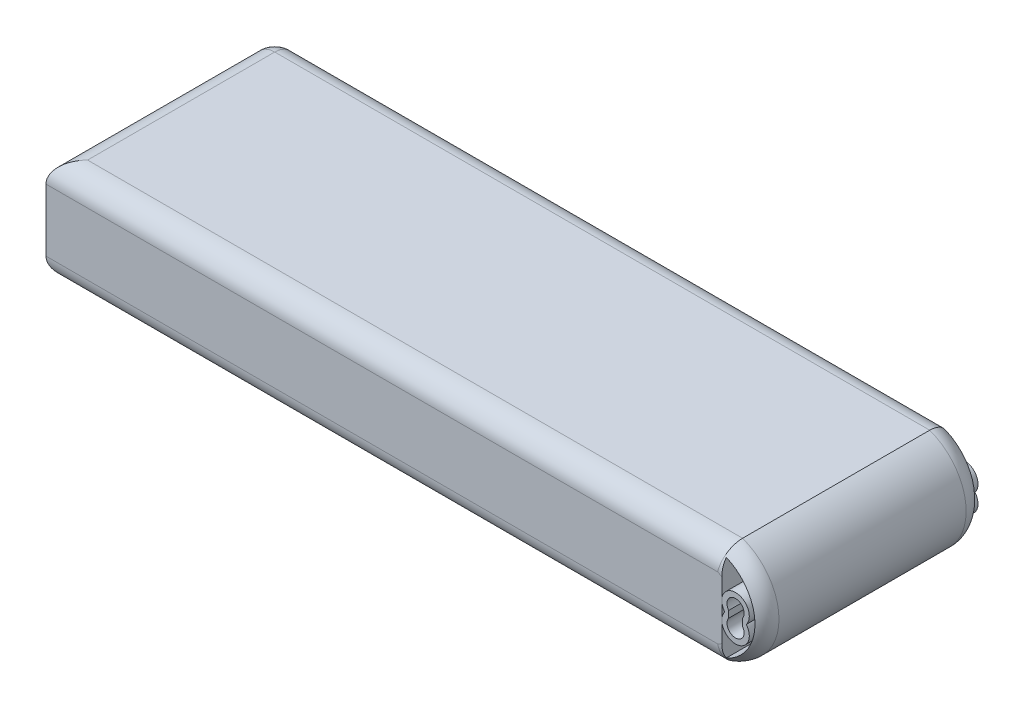
ISO-10303-21;
HEADER;
FILE_DESCRIPTION(('STEP AP214'),'2;1');
FILE_NAME('part.step','',(''),(''),'','','');
FILE_SCHEMA(('AUTOMOTIVE_DESIGN { 1 0 10303 214 1 1 1 1 }'));
ENDSEC;
DATA;
#1=APPLICATION_CONTEXT('core data for automotive mechanical design processes');
#2=APPLICATION_PROTOCOL_DEFINITION('international standard','automotive_design',2000,#1);
#3=PRODUCT_CONTEXT('',#1,'mechanical');
#4=PRODUCT('Part','Part','',(#3));
#5=PRODUCT_RELATED_PRODUCT_CATEGORY('part','',(#4));
#6=PRODUCT_DEFINITION_FORMATION('','',#4);
#7=PRODUCT_DEFINITION_CONTEXT('part definition',#1,'design');
#8=PRODUCT_DEFINITION('design','',#6,#7);
#9=PRODUCT_DEFINITION_SHAPE('','',#8);
#10=(LENGTH_UNIT() NAMED_UNIT(*) SI_UNIT(.MILLI.,.METRE.));
#11=(NAMED_UNIT(*) PLANE_ANGLE_UNIT() SI_UNIT($,.RADIAN.));
#12=(NAMED_UNIT(*) SI_UNIT($,.STERADIAN.) SOLID_ANGLE_UNIT());
#13=UNCERTAINTY_MEASURE_WITH_UNIT(LENGTH_MEASURE(1.E-05),#10,'distance_accuracy_value','');
#14=(GEOMETRIC_REPRESENTATION_CONTEXT(3) GLOBAL_UNCERTAINTY_ASSIGNED_CONTEXT((#13)) GLOBAL_UNIT_ASSIGNED_CONTEXT((#10,
#11,#12)) REPRESENTATION_CONTEXT('',''));
#15=CARTESIAN_POINT('',(0.,0.,0.));
#16=DIRECTION('',(0.,0.,1.));
#17=DIRECTION('',(1.,0.,0.));
#18=AXIS2_PLACEMENT_3D('',#15,#16,#17);
#19=CARTESIAN_POINT('',(132.644271500693,11.6442715006931,-10.076462245077));
#20=DIRECTION('',(0.,0.,1.));
#21=DIRECTION('',(1.,0.,0.));
#22=AXIS2_PLACEMENT_3D('',#19,#20,#21);
#23=CYLINDRICAL_SURFACE('',#22,1.64427150069308);
#24=DIRECTION('',(0.,0.,1.));
#25=VECTOR('',#24,1.);
#26=CARTESIAN_POINT('',(131.333122613471,10.6520430171627,-10.076462245077));
#27=LINE('',#26,#25);
#28=CARTESIAN_POINT('',(131.333122613471,10.6520430171627,0.));
#29=VERTEX_POINT('',#28);
#30=CARTESIAN_POINT('',(131.333122613471,10.6520430171627,44.));
#31=VERTEX_POINT('',#30);
#32=EDGE_CURVE('E127',#29,#31,#27,.T.);
#33=ORIENTED_EDGE('',*,*,#32,.F.);
#34=CARTESIAN_POINT('',(132.644271500693,11.6442715006931,0.));
#35=DIRECTION('',(0.,0.,1.));
#36=DIRECTION('',(1.,0.,0.));
#37=AXIS2_PLACEMENT_3D('',#34,#35,#36);
#38=CIRCLE('',#37,1.64427150069308);
#39=CARTESIAN_POINT('',(133.955420387915,10.6520430171627,0.));
#40=VERTEX_POINT('',#39);
#41=EDGE_CURVE('E131',#29,#40,#38,.F.);
#42=ORIENTED_EDGE('',*,*,#41,.T.);
#43=DIRECTION('',(0.,0.,1.));
#44=VECTOR('',#43,1.);
#45=CARTESIAN_POINT('',(133.955420387915,10.6520430171627,-10.076462245077));
#46=LINE('',#45,#44);
#47=CARTESIAN_POINT('',(133.955420387915,10.6520430171627,44.));
#48=VERTEX_POINT('',#47);
#49=EDGE_CURVE('E134',#40,#48,#46,.T.);
#50=ORIENTED_EDGE('',*,*,#49,.T.);
#51=CARTESIAN_POINT('',(132.644271500693,11.6442715006931,44.));
#52=DIRECTION('',(0.,0.,1.));
#53=DIRECTION('',(1.,0.,0.));
#54=AXIS2_PLACEMENT_3D('',#51,#52,#53);
#55=CIRCLE('',#54,1.64427150069308);
#56=EDGE_CURVE('E125',#48,#31,#55,.T.);
#57=ORIENTED_EDGE('',*,*,#56,.T.);
#58=EDGE_LOOP('',(#33,#42,#50,#57));
#59=FACE_BOUND('',#58,.T.);
#60=ADVANCED_FACE('F55',(#59),#23,.F.);
#61=CARTESIAN_POINT('',(131.333122613471,0.,-10.076462245077));
#62=DIRECTION('',(-1.,0.,0.));
#63=DIRECTION('',(0.,0.,1.));
#64=AXIS2_PLACEMENT_3D('',#61,#62,#63);
#65=PLANE('',#64);
#66=DIRECTION('',(0.,0.,1.));
#67=VECTOR('',#66,1.);
#68=CARTESIAN_POINT('',(131.333122613471,9.34795698283731,-10.076462245077));
#69=LINE('',#68,#67);
#70=CARTESIAN_POINT('',(131.333122613471,9.34795698283731,0.));
#71=VERTEX_POINT('',#70);
#72=CARTESIAN_POINT('',(131.333122613471,9.34795698283731,44.));
#73=VERTEX_POINT('',#72);
#74=EDGE_CURVE('E128',#71,#73,#69,.T.);
#75=ORIENTED_EDGE('',*,*,#74,.F.);
#76=DIRECTION('',(0.,1.,0.));
#77=VECTOR('',#76,1.);
#78=CARTESIAN_POINT('',(131.333122613471,0.,0.));
#79=LINE('',#78,#77);
#80=EDGE_CURVE('E129',#71,#29,#79,.T.);
#81=ORIENTED_EDGE('',*,*,#80,.T.);
#82=ORIENTED_EDGE('',*,*,#32,.T.);
#83=DIRECTION('',(0.,-1.,0.));
#84=VECTOR('',#83,1.);
#85=CARTESIAN_POINT('',(131.333122613471,0.,44.));
#86=LINE('',#85,#84);
#87=EDGE_CURVE('E126',#31,#73,#86,.T.);
#88=ORIENTED_EDGE('',*,*,#87,.T.);
#89=EDGE_LOOP('',(#75,#81,#82,#88));
#90=FACE_BOUND('',#89,.T.);
#91=ADVANCED_FACE('F161',(#90),#65,.F.);
#92=CARTESIAN_POINT('',(132.644271500693,8.35572849930693,-10.076462245077));
#93=DIRECTION('',(0.,0.,1.));
#94=DIRECTION('',(1.,0.,0.));
#95=AXIS2_PLACEMENT_3D('',#92,#93,#94);
#96=CYLINDRICAL_SURFACE('',#95,1.64427150069308);
#97=CARTESIAN_POINT('',(132.644271500693,8.35572849930693,0.));
#98=DIRECTION('',(0.,0.,1.));
#99=DIRECTION('',(1.,0.,0.));
#100=AXIS2_PLACEMENT_3D('',#97,#98,#99);
#101=CIRCLE('',#100,1.64427150069308);
#102=CARTESIAN_POINT('',(133.955420387915,9.34795698283731,0.));
#103=VERTEX_POINT('',#102);
#104=EDGE_CURVE('E57',#71,#103,#101,.T.);
#105=ORIENTED_EDGE('',*,*,#104,.F.);
#106=ORIENTED_EDGE('',*,*,#74,.T.);
#107=CARTESIAN_POINT('',(132.644271500693,8.35572849930693,44.));
#108=DIRECTION('',(0.,0.,1.));
#109=DIRECTION('',(1.,0.,0.));
#110=AXIS2_PLACEMENT_3D('',#107,#108,#109);
#111=CIRCLE('',#110,1.64427150069308);
#112=CARTESIAN_POINT('',(133.955420387915,9.34795698283731,44.));
#113=VERTEX_POINT('',#112);
#114=EDGE_CURVE('E116',#113,#73,#111,.F.);
#115=ORIENTED_EDGE('',*,*,#114,.F.);
#116=DIRECTION('',(0.,0.,1.));
#117=VECTOR('',#116,1.);
#118=CARTESIAN_POINT('',(133.955420387915,9.34795698283731,-10.076462245077));
#119=LINE('',#118,#117);
#120=EDGE_CURVE('E113',#103,#113,#119,.T.);
#121=ORIENTED_EDGE('',*,*,#120,.F.);
#122=EDGE_LOOP('',(#105,#106,#115,#121));
#123=FACE_BOUND('',#122,.T.);
#124=ADVANCED_FACE('F158',(#123),#96,.F.);
#125=CARTESIAN_POINT('',(132.644271500693,8.35572849930693,-10.076462245077));
#126=DIRECTION('',(0.,0.,1.));
#127=DIRECTION('',(1.,0.,0.));
#128=AXIS2_PLACEMENT_3D('',#125,#126,#127);
#129=CYLINDRICAL_SURFACE('',#128,2.64427150069308);
#130=DIRECTION('',(0.,0.,1.));
#131=VECTOR('',#130,1.);
#132=CARTESIAN_POINT('',(130.573391735621,10.,-10.076462245077));
#133=LINE('',#132,#131);
#134=CARTESIAN_POINT('',(130.573391735621,10.,0.));
#135=VERTEX_POINT('',#134);
#136=CARTESIAN_POINT('',(130.573391735621,10.,44.));
#137=VERTEX_POINT('',#136);
#138=EDGE_CURVE('E100',#135,#137,#133,.T.);
#139=ORIENTED_EDGE('',*,*,#138,.F.);
#140=CARTESIAN_POINT('',(132.644271500693,8.35572849930693,0.));
#141=DIRECTION('',(0.,0.,1.));
#142=DIRECTION('',(1.,0.,0.));
#143=AXIS2_PLACEMENT_3D('',#140,#141,#142);
#144=CIRCLE('',#143,2.64427150069308);
#145=CARTESIAN_POINT('',(134.715151265765,10.,0.));
#146=VERTEX_POINT('',#145);
#147=EDGE_CURVE('E67',#135,#146,#144,.T.);
#148=ORIENTED_EDGE('',*,*,#147,.T.);
#149=DIRECTION('',(0.,0.,1.));
#150=VECTOR('',#149,1.);
#151=CARTESIAN_POINT('',(134.715151265765,10.,-10.076462245077));
#152=LINE('',#151,#150);
#153=CARTESIAN_POINT('',(134.715151265765,10.,44.));
#154=VERTEX_POINT('',#153);
#155=EDGE_CURVE('E105',#146,#154,#152,.T.);
#156=ORIENTED_EDGE('',*,*,#155,.T.);
#157=CARTESIAN_POINT('',(132.644271500693,8.35572849930693,44.));
#158=DIRECTION('',(0.,0.,1.));
#159=DIRECTION('',(1.,0.,0.));
#160=AXIS2_PLACEMENT_3D('',#157,#158,#159);
#161=CIRCLE('',#160,2.64427150069308);
#162=EDGE_CURVE('E104',#154,#137,#161,.F.);
#163=ORIENTED_EDGE('',*,*,#162,.T.);
#164=EDGE_LOOP('',(#139,#148,#156,#163));
#165=FACE_BOUND('',#164,.T.);
#166=ADVANCED_FACE('F102',(#165),#129,.T.);
#167=CARTESIAN_POINT('',(132.644271500693,11.6442715006931,-10.076462245077));
#168=DIRECTION('',(0.,0.,1.));
#169=DIRECTION('',(1.,0.,0.));
#170=AXIS2_PLACEMENT_3D('',#167,#168,#169);
#171=CYLINDRICAL_SURFACE('',#170,2.64427150069308);
#172=CARTESIAN_POINT('',(132.644271500693,11.6442715006931,0.));
#173=DIRECTION('',(0.,0.,1.));
#174=DIRECTION('',(1.,0.,0.));
#175=AXIS2_PLACEMENT_3D('',#172,#173,#174);
#176=CIRCLE('',#175,2.64427150069308);
#177=EDGE_CURVE('E12',#135,#146,#176,.F.);
#178=ORIENTED_EDGE('',*,*,#177,.F.);
#179=ORIENTED_EDGE('',*,*,#138,.T.);
#180=CARTESIAN_POINT('',(132.644271500693,11.6442715006931,44.));
#181=DIRECTION('',(0.,0.,1.));
#182=DIRECTION('',(1.,0.,0.));
#183=AXIS2_PLACEMENT_3D('',#180,#181,#182);
#184=CIRCLE('',#183,2.64427150069308);
#185=EDGE_CURVE('E112',#154,#137,#184,.T.);
#186=ORIENTED_EDGE('',*,*,#185,.F.);
#187=ORIENTED_EDGE('',*,*,#155,.F.);
#188=EDGE_LOOP('',(#178,#179,#186,#187));
#189=FACE_BOUND('',#188,.T.);
#190=ADVANCED_FACE('F114',(#189),#171,.T.);
#191=CARTESIAN_POINT('',(133.955420387915,0.,-10.076462245077));
#192=DIRECTION('',(-1.,0.,0.));
#193=DIRECTION('',(0.,0.,1.));
#194=AXIS2_PLACEMENT_3D('',#191,#192,#193);
#195=PLANE('',#194);
#196=DIRECTION('',(0.,1.,0.));
#197=VECTOR('',#196,1.);
#198=CARTESIAN_POINT('',(133.955420387915,0.,0.));
#199=LINE('',#198,#197);
#200=EDGE_CURVE('E65',#103,#40,#199,.T.);
#201=ORIENTED_EDGE('',*,*,#200,.F.);
#202=ORIENTED_EDGE('',*,*,#120,.T.);
#203=DIRECTION('',(0.,-1.,0.));
#204=VECTOR('',#203,1.);
#205=CARTESIAN_POINT('',(133.955420387915,0.,44.));
#206=LINE('',#205,#204);
#207=EDGE_CURVE('E111',#48,#113,#206,.T.);
#208=ORIENTED_EDGE('',*,*,#207,.F.);
#209=ORIENTED_EDGE('',*,*,#49,.F.);
#210=EDGE_LOOP('',(#201,#202,#208,#209));
#211=FACE_BOUND('',#210,.T.);
#212=ADVANCED_FACE('F153',(#211),#195,.T.);
#213=CARTESIAN_POINT('',(0.,0.,44.));
#214=DIRECTION('',(0.,0.,1.));
#215=DIRECTION('',(1.,0.,0.));
#216=AXIS2_PLACEMENT_3D('',#213,#214,#215);
#217=PLANE('',#216);
#218=ORIENTED_EDGE('',*,*,#162,.F.);
#219=ORIENTED_EDGE('',*,*,#185,.T.);
#220=EDGE_LOOP('',(#218,#219));
#221=FACE_BOUND('',#220,.T.);
#222=ORIENTED_EDGE('',*,*,#56,.F.);
#223=ORIENTED_EDGE('',*,*,#207,.T.);
#224=ORIENTED_EDGE('',*,*,#114,.T.);
#225=ORIENTED_EDGE('',*,*,#87,.F.);
#226=EDGE_LOOP('',(#222,#223,#224,#225));
#227=FACE_BOUND('',#226,.T.);
#228=ADVANCED_FACE('F108',(#221,#227),#217,.T.);
#229=CARTESIAN_POINT('',(0.,0.,0.));
#230=DIRECTION('',(0.,0.,1.));
#231=DIRECTION('',(1.,0.,0.));
#232=AXIS2_PLACEMENT_3D('',#229,#230,#231);
#233=PLANE('',#232);
#234=ORIENTED_EDGE('',*,*,#80,.F.);
#235=ORIENTED_EDGE('',*,*,#104,.T.);
#236=ORIENTED_EDGE('',*,*,#200,.T.);
#237=ORIENTED_EDGE('',*,*,#41,.F.);
#238=EDGE_LOOP('',(#234,#235,#236,#237));
#239=FACE_BOUND('',#238,.T.);
#240=ORIENTED_EDGE('',*,*,#177,.T.);
#241=ORIENTED_EDGE('',*,*,#147,.F.);
#242=EDGE_LOOP('',(#240,#241));
#243=FACE_BOUND('',#242,.T.);
#244=ADVANCED_FACE('F53',(#239,#243),#233,.F.);
#245=CLOSED_SHELL('',(#60,#91,#124,#166,#190,#212,#228,#244));
#246=MANIFOLD_SOLID_BREP('B2',#245);
#247=CARTESIAN_POINT('',(0.,20.,44.));
#248=DIRECTION('',(0.,1.,0.));
#249=DIRECTION('',(0.,0.,1.));
#250=AXIS2_PLACEMENT_3D('',#247,#248,#249);
#251=PLANE('',#250);
#252=DIRECTION('',(0.,0.,-1.));
#253=VECTOR('',#252,1.);
#254=CARTESIAN_POINT('',(130.,20.,44.));
#255=LINE('',#254,#253);
#256=CARTESIAN_POINT('',(130.,20.,40.));
#257=VERTEX_POINT('',#256);
#258=CARTESIAN_POINT('',(130.,20.,4.));
#259=VERTEX_POINT('',#258);
#260=EDGE_CURVE('E467',#257,#259,#255,.T.);
#261=ORIENTED_EDGE('',*,*,#260,.T.);
#262=DIRECTION('',(1.,0.,0.));
#263=VECTOR('',#262,1.);
#264=CARTESIAN_POINT('',(0.,20.,4.));
#265=LINE('',#264,#263);
#266=CARTESIAN_POINT('',(4.,20.,4.));
#267=VERTEX_POINT('',#266);
#268=EDGE_CURVE('E544',#259,#267,#265,.F.);
#269=ORIENTED_EDGE('',*,*,#268,.T.);
#270=DIRECTION('',(0.,0.,-1.));
#271=VECTOR('',#270,1.);
#272=CARTESIAN_POINT('',(4.,20.,44.));
#273=LINE('',#272,#271);
#274=CARTESIAN_POINT('',(4.,20.,40.));
#275=VERTEX_POINT('',#274);
#276=EDGE_CURVE('E538',#267,#275,#273,.F.);
#277=ORIENTED_EDGE('',*,*,#276,.T.);
#278=DIRECTION('',(1.,0.,0.));
#279=VECTOR('',#278,1.);
#280=CARTESIAN_POINT('',(0.,20.,40.));
#281=LINE('',#280,#279);
#282=EDGE_CURVE('E539',#275,#257,#281,.T.);
#283=ORIENTED_EDGE('',*,*,#282,.T.);
#284=EDGE_LOOP('',(#261,#269,#277,#283));
#285=FACE_BOUND('',#284,.T.);
#286=ADVANCED_FACE('F241',(#285),#251,.T.);
#287=CARTESIAN_POINT('',(0.,0.,44.));
#288=DIRECTION('',(-1.,0.,0.));
#289=DIRECTION('',(0.,0.,1.));
#290=AXIS2_PLACEMENT_3D('',#287,#288,#289);
#291=PLANE('',#290);
#292=DIRECTION('',(0.,1.,0.));
#293=VECTOR('',#292,1.);
#294=CARTESIAN_POINT('',(0.,0.,4.));
#295=LINE('',#294,#293);
#296=CARTESIAN_POINT('',(0.,16.,4.));
#297=VERTEX_POINT('',#296);
#298=CARTESIAN_POINT('',(0.,4.,4.));
#299=VERTEX_POINT('',#298);
#300=EDGE_CURVE('E483',#297,#299,#295,.F.);
#301=ORIENTED_EDGE('',*,*,#300,.T.);
#302=DIRECTION('',(0.,0.,-1.));
#303=VECTOR('',#302,1.);
#304=CARTESIAN_POINT('',(0.,4.,44.));
#305=LINE('',#304,#303);
#306=CARTESIAN_POINT('',(0.,4.,44.));
#307=VERTEX_POINT('',#306);
#308=EDGE_CURVE('E486',#299,#307,#305,.F.);
#309=ORIENTED_EDGE('',*,*,#308,.T.);
#310=DIRECTION('',(0.,1.,0.));
#311=VECTOR('',#310,1.);
#312=CARTESIAN_POINT('',(0.,0.,44.));
#313=LINE('',#312,#311);
#314=CARTESIAN_POINT('',(0.,16.,44.));
#315=VERTEX_POINT('',#314);
#316=EDGE_CURVE('E473',#307,#315,#313,.T.);
#317=ORIENTED_EDGE('',*,*,#316,.T.);
#318=DIRECTION('',(0.,0.,-1.));
#319=VECTOR('',#318,1.);
#320=CARTESIAN_POINT('',(0.,16.,44.));
#321=LINE('',#320,#319);
#322=EDGE_CURVE('E481',#315,#297,#321,.T.);
#323=ORIENTED_EDGE('',*,*,#322,.T.);
#324=EDGE_LOOP('',(#301,#309,#317,#323));
#325=FACE_BOUND('',#324,.T.);
#326=ADVANCED_FACE('F439',(#325),#291,.T.);
#327=CARTESIAN_POINT('',(0.,0.,44.));
#328=DIRECTION('',(0.,1.,0.));
#329=DIRECTION('',(0.,0.,1.));
#330=AXIS2_PLACEMENT_3D('',#327,#328,#329);
#331=PLANE('',#330);
#332=DIRECTION('',(0.,0.,-1.));
#333=VECTOR('',#332,1.);
#334=CARTESIAN_POINT('',(4.,0.,0.));
#335=LINE('',#334,#333);
#336=CARTESIAN_POINT('',(4.,0.,40.));
#337=VERTEX_POINT('',#336);
#338=CARTESIAN_POINT('',(4.,0.,4.));
#339=VERTEX_POINT('',#338);
#340=EDGE_CURVE('E488',#337,#339,#335,.T.);
#341=ORIENTED_EDGE('',*,*,#340,.T.);
#342=DIRECTION('',(1.,0.,0.));
#343=VECTOR('',#342,1.);
#344=CARTESIAN_POINT('',(0.,0.,4.));
#345=LINE('',#344,#343);
#346=CARTESIAN_POINT('',(130.,0.,4.));
#347=VERTEX_POINT('',#346);
#348=EDGE_CURVE('E495',#339,#347,#345,.T.);
#349=ORIENTED_EDGE('',*,*,#348,.T.);
#350=DIRECTION('',(0.,0.,-1.));
#351=VECTOR('',#350,1.);
#352=CARTESIAN_POINT('',(130.,0.,44.));
#353=LINE('',#352,#351);
#354=CARTESIAN_POINT('',(130.,0.,40.));
#355=VERTEX_POINT('',#354);
#356=EDGE_CURVE('E469',#355,#347,#353,.T.);
#357=ORIENTED_EDGE('',*,*,#356,.F.);
#358=DIRECTION('',(1.,0.,0.));
#359=VECTOR('',#358,1.);
#360=CARTESIAN_POINT('',(0.,0.,40.));
#361=LINE('',#360,#359);
#362=EDGE_CURVE('E489',#355,#337,#361,.F.);
#363=ORIENTED_EDGE('',*,*,#362,.T.);
#364=EDGE_LOOP('',(#341,#349,#357,#363));
#365=FACE_BOUND('',#364,.T.);
#366=ADVANCED_FACE('F448',(#365),#331,.F.);
#367=CARTESIAN_POINT('',(130.,0.,44.));
#368=DIRECTION('',(1.,0.,0.));
#369=DIRECTION('',(0.,0.,-1.));
#370=AXIS2_PLACEMENT_3D('',#367,#368,#369);
#371=PLANE('',#370);
#372=DIRECTION('',(0.,-1.,0.));
#373=VECTOR('',#372,1.);
#374=CARTESIAN_POINT('',(130.,0.,0.));
#375=LINE('',#374,#373);
#376=CARTESIAN_POINT('',(130.,15.5549205986353,0.));
#377=VERTEX_POINT('',#376);
#378=CARTESIAN_POINT('',(130.,4.44507940136469,0.));
#379=VERTEX_POINT('',#378);
#380=EDGE_CURVE('E349',#377,#379,#375,.T.);
#381=ORIENTED_EDGE('',*,*,#380,.F.);
#382=CARTESIAN_POINT('',(130.,15.5549205986353,0.));
#383=CARTESIAN_POINT('',(130.,15.6976238443516,-2.41215455075251E-05));
#384=CARTESIAN_POINT('',(130.,15.8403814407999,0.00534121100765735));
#385=CARTESIAN_POINT('',(130.,16.1251599813797,0.0274343705767493));
#386=CARTESIAN_POINT('',(130.,16.2671799722999,0.0441743661980458));
#387=CARTESIAN_POINT('',(130.,16.5453785254367,0.0889670740029389));
#388=CARTESIAN_POINT('',(130.,16.6816093150312,0.116689970074863));
#389=CARTESIAN_POINT('',(130.,16.951090077618,0.183722170748763));
#390=CARTESIAN_POINT('',(130.,17.084341520462,0.22302562007874));
#391=CARTESIAN_POINT('',(130.,17.4219262991574,0.339352781068202));
#392=CARTESIAN_POINT('',(130.,17.623383710497,0.425098612690218));
#393=CARTESIAN_POINT('',(130.,17.916334253673,0.576500390907117));
#394=CARTESIAN_POINT('',(130.,18.0134699144604,0.631507949159354));
#395=CARTESIAN_POINT('',(130.,18.2031987456665,0.748961579507108));
#396=CARTESIAN_POINT('',(130.,18.2957896281699,0.811411344990442));
#397=CARTESIAN_POINT('',(130.,18.3857872958613,0.877501000800804));
#398=B_SPLINE_CURVE_WITH_KNOTS('',3,(#382,#383,#384,#385,#386,#387,#388,#389,#390,#391,#392,
#393,#394,#395,#396,#397),.UNSPECIFIED.,.F.,.F.,(4,2,2,2,2,2,2,4),(0.,0.428087431495244,
0.856633553112711,1.27318262604771,1.68952144694064,2.34368340805071,2.6782813299145,
3.01304600163082),.UNSPECIFIED.);
#399=CARTESIAN_POINT('',(130.,18.3857872958613,0.8775010008008));
#400=VERTEX_POINT('',#399);
#401=EDGE_CURVE('E361',#377,#400,#398,.T.);
#402=ORIENTED_EDGE('',*,*,#401,.T.);
#403=DIRECTION('',(0.,0.,-1.));
#404=VECTOR('',#403,1.);
#405=CARTESIAN_POINT('',(130.,18.3857872958613,44.));
#406=LINE('',#405,#404);
#407=CARTESIAN_POINT('',(130.,18.3857872958613,43.1224989991992));
#408=VERTEX_POINT('',#407);
#409=EDGE_CURVE('E464',#408,#400,#406,.T.);
#410=ORIENTED_EDGE('',*,*,#409,.F.);
#411=CARTESIAN_POINT('',(130.,18.3857872958613,43.1224989991992));
#412=CARTESIAN_POINT('',(130.,18.2816593552926,43.1989912053361));
#413=CARTESIAN_POINT('',(130.,18.17399489194,43.2706114121549));
#414=CARTESIAN_POINT('',(130.,17.9527288296011,43.4038379847124));
#415=CARTESIAN_POINT('',(130.,17.8391311533703,43.4654508587816));
#416=CARTESIAN_POINT('',(130.,17.6098744338619,43.5770916069226));
#417=CARTESIAN_POINT('',(130.,17.4943363893686,43.6273689054362));
#418=CARTESIAN_POINT('',(130.,17.2595028218367,43.7182067019411));
#419=CARTESIAN_POINT('',(130.,17.1402071179639,43.7587667314861));
#420=CARTESIAN_POINT('',(130.,16.9023582740701,43.8291807402949));
#421=CARTESIAN_POINT('',(130.,16.7838882153335,43.8593167885173));
#422=CARTESIAN_POINT('',(130.,16.545028848838,43.9106895511006));
#423=CARTESIAN_POINT('',(130.,16.4246393440068,43.9319253454721));
#424=CARTESIAN_POINT('',(130.,16.1796429307309,43.9661791551811));
#425=CARTESIAN_POINT('',(130.,16.0550057879188,43.9789786739783));
#426=CARTESIAN_POINT('',(130.,15.8052074105201,43.9958942063792));
#427=CARTESIAN_POINT('',(130.,15.6800465018847,44.0000149920128));
#428=CARTESIAN_POINT('',(130.,15.5549205986353,44.));
#429=B_SPLINE_CURVE_WITH_KNOTS('',3,(#411,#412,#413,#414,#415,#416,#417,#418,#419,#420,#421,
#422,#423,#424,#425,#426,#427,#428),.UNSPECIFIED.,.F.,.F.,(4,2,2,2,2,2,2,2,4),(0.,
0.387424743703705,0.774596505626408,1.15216591650257,1.52975352544038,1.89613238602292,
2.26254910861906,2.63811754967449,3.01347942921667),.UNSPECIFIED.);
#430=CARTESIAN_POINT('',(130.,15.5549205986353,44.));
#431=VERTEX_POINT('',#430);
#432=EDGE_CURVE('E494',#408,#431,#429,.T.);
#433=ORIENTED_EDGE('',*,*,#432,.T.);
#434=DIRECTION('',(0.,-1.,0.));
#435=VECTOR('',#434,1.);
#436=CARTESIAN_POINT('',(130.,0.,44.));
#437=LINE('',#436,#435);
#438=CARTESIAN_POINT('',(130.,4.44507940136469,44.));
#439=VERTEX_POINT('',#438);
#440=EDGE_CURVE('E366',#431,#439,#437,.T.);
#441=ORIENTED_EDGE('',*,*,#440,.T.);
#442=CARTESIAN_POINT('',(130.,4.44507940136469,44.));
#443=CARTESIAN_POINT('',(130.,4.30237615564838,44.0000241215455));
#444=CARTESIAN_POINT('',(130.,4.15961855920007,43.9946587889923));
#445=CARTESIAN_POINT('',(130.,3.87484001862034,43.9725656294233));
#446=CARTESIAN_POINT('',(130.,3.73282002770008,43.955825633802));
#447=CARTESIAN_POINT('',(130.,3.45462147456335,43.9110329259971));
#448=CARTESIAN_POINT('',(130.,3.31839068496879,43.8833100299251));
#449=CARTESIAN_POINT('',(130.,3.04890992238199,43.8162778292512));
#450=CARTESIAN_POINT('',(130.,2.91565847953796,43.7769743799213));
#451=CARTESIAN_POINT('',(130.,2.57807370084258,43.6606472189318));
#452=CARTESIAN_POINT('',(130.,2.37661628950298,43.5749013873098));
#453=CARTESIAN_POINT('',(130.,2.08366574632702,43.4234996090929));
#454=CARTESIAN_POINT('',(130.,1.98653008553963,43.3684920508406));
#455=CARTESIAN_POINT('',(130.,1.79680125433353,43.2510384204929));
#456=CARTESIAN_POINT('',(130.,1.70421037183009,43.1885886550096));
#457=CARTESIAN_POINT('',(130.,1.61421270413871,43.1224989991992));
#458=B_SPLINE_CURVE_WITH_KNOTS('',3,(#442,#443,#444,#445,#446,#447,#448,#449,#450,#451,#452,
#453,#454,#455,#456,#457),.UNSPECIFIED.,.F.,.F.,(4,2,2,2,2,2,2,4),(0.,0.428087431495247,
0.856633553112709,1.27318262604771,1.68952144694064,2.34368340805071,2.67828132991449,
3.01304600163082),.UNSPECIFIED.);
#459=CARTESIAN_POINT('',(130.,1.61421270413871,43.1224989991992));
#460=VERTEX_POINT('',#459);
#461=EDGE_CURVE('E376',#439,#460,#458,.T.);
#462=ORIENTED_EDGE('',*,*,#461,.T.);
#463=DIRECTION('',(0.,0.,-1.));
#464=VECTOR('',#463,1.);
#465=CARTESIAN_POINT('',(130.,1.61421270413871,44.));
#466=LINE('',#465,#464);
#467=CARTESIAN_POINT('',(130.,1.61421270413871,0.8775010008008));
#468=VERTEX_POINT('',#467);
#469=EDGE_CURVE('E470',#460,#468,#466,.T.);
#470=ORIENTED_EDGE('',*,*,#469,.T.);
#471=CARTESIAN_POINT('',(130.,1.61421270413871,0.877501000800802));
#472=CARTESIAN_POINT('',(130.,1.71834064470738,0.801008794663868));
#473=CARTESIAN_POINT('',(130.,1.82600510806,0.729388587845137));
#474=CARTESIAN_POINT('',(130.,2.04727117039889,0.596162015287585));
#475=CARTESIAN_POINT('',(130.,2.16086884662968,0.534549141218441));
#476=CARTESIAN_POINT('',(130.,2.39012556613809,0.42290839307741));
#477=CARTESIAN_POINT('',(130.,2.5056636106314,0.372631094563796));
#478=CARTESIAN_POINT('',(130.,2.74049717816329,0.281793298058853));
#479=CARTESIAN_POINT('',(130.,2.85979288203612,0.241233268513929));
#480=CARTESIAN_POINT('',(130.,3.09764172592991,0.170819259705142));
#481=CARTESIAN_POINT('',(130.,3.21611178466646,0.140683211482664));
#482=CARTESIAN_POINT('',(130.,3.45497115116201,0.0893104488994274));
#483=CARTESIAN_POINT('',(130.,3.57536065599323,0.0680746545279196));
#484=CARTESIAN_POINT('',(130.,3.8203570692691,0.0338208448189308));
#485=CARTESIAN_POINT('',(130.,3.94499421208118,0.021021326021692));
#486=CARTESIAN_POINT('',(130.,4.19479258947989,0.00410579362076811));
#487=CARTESIAN_POINT('',(130.,4.3199534981153,-1.49920128500728E-05));
#488=CARTESIAN_POINT('',(130.,4.44507940136469,0.));
#489=B_SPLINE_CURVE_WITH_KNOTS('',3,(#471,#472,#473,#474,#475,#476,#477,#478,#479,#480,#481,
#482,#483,#484,#485,#486,#487,#488),.UNSPECIFIED.,.F.,.F.,(4,2,2,2,2,2,2,2,4),(0.,
0.387424743703704,0.774596505626409,1.15216591650257,1.52975352544039,1.89613238602292,
2.26254910861906,2.63811754967448,3.01347942921666),.UNSPECIFIED.);
#490=EDGE_CURVE('E370',#468,#379,#489,.T.);
#491=ORIENTED_EDGE('',*,*,#490,.T.);
#492=EDGE_LOOP('',(#381,#402,#410,#433,#441,#462,#470,#491));
#493=FACE_BOUND('',#492,.T.);
#494=ADVANCED_FACE('F363',(#493),#371,.T.);
#495=CARTESIAN_POINT('',(126.357142857143,10.,44.));
#496=DIRECTION('',(0.,0.,-1.));
#497=DIRECTION('',(-1.,0.,0.));
#498=AXIS2_PLACEMENT_3D('',#495,#496,#497);
#499=CYLINDRICAL_SURFACE('',#498,9.14285714285714);
#500=ORIENTED_EDGE('',*,*,#409,.T.);
#501=CARTESIAN_POINT('',(126.357142857143,10.,0.877501000800807));
#502=DIRECTION('',(0.,0.,-1.));
#503=DIRECTION('',(-1.,0.,0.));
#504=AXIS2_PLACEMENT_3D('',#501,#502,#503);
#505=CIRCLE('',#504,9.14285714285714);
#506=EDGE_CURVE('E375',#400,#468,#505,.T.);
#507=ORIENTED_EDGE('',*,*,#506,.T.);
#508=ORIENTED_EDGE('',*,*,#469,.F.);
#509=CARTESIAN_POINT('',(126.357142857143,10.,43.1224989991992));
#510=DIRECTION('',(0.,0.,-1.));
#511=DIRECTION('',(-1.,0.,0.));
#512=AXIS2_PLACEMENT_3D('',#509,#510,#511);
#513=CIRCLE('',#512,9.14285714285714);
#514=EDGE_CURVE('E373',#460,#408,#513,.F.);
#515=ORIENTED_EDGE('',*,*,#514,.T.);
#516=EDGE_LOOP('',(#500,#507,#508,#515));
#517=FACE_BOUND('',#516,.T.);
#518=ADVANCED_FACE('F451',(#517),#499,.F.);
#519=CARTESIAN_POINT('',(126.357142857143,10.,44.));
#520=DIRECTION('',(0.,0.,-1.));
#521=DIRECTION('',(-1.,0.,0.));
#522=AXIS2_PLACEMENT_3D('',#519,#520,#521);
#523=CYLINDRICAL_SURFACE('',#522,10.6428571428571);
#524=ORIENTED_EDGE('',*,*,#356,.T.);
#525=CARTESIAN_POINT('',(126.357142857143,10.,4.));
#526=DIRECTION('',(0.,0.,1.));
#527=DIRECTION('',(1.,0.,0.));
#528=AXIS2_PLACEMENT_3D('',#525,#526,#527);
#529=CIRCLE('',#528,10.6428571428571);
#530=EDGE_CURVE('E513',#347,#259,#529,.T.);
#531=ORIENTED_EDGE('',*,*,#530,.T.);
#532=ORIENTED_EDGE('',*,*,#260,.F.);
#533=CARTESIAN_POINT('',(126.357142857143,10.,40.));
#534=DIRECTION('',(0.,0.,1.));
#535=DIRECTION('',(1.,0.,0.));
#536=AXIS2_PLACEMENT_3D('',#533,#534,#535);
#537=CIRCLE('',#536,10.6428571428571);
#538=EDGE_CURVE('E519',#257,#355,#537,.F.);
#539=ORIENTED_EDGE('',*,*,#538,.T.);
#540=EDGE_LOOP('',(#524,#531,#532,#539));
#541=FACE_BOUND('',#540,.T.);
#542=ADVANCED_FACE('F453',(#541),#523,.T.);
#543=CARTESIAN_POINT('',(0.,0.,44.));
#544=DIRECTION('',(0.,0.,1.));
#545=DIRECTION('',(1.,0.,0.));
#546=AXIS2_PLACEMENT_3D('',#543,#544,#545);
#547=PLANE('',#546);
#548=ORIENTED_EDGE('',*,*,#440,.F.);
#549=CARTESIAN_POINT('',(126.357142857143,10.,44.));
#550=DIRECTION('',(0.,0.,1.));
#551=DIRECTION('',(1.,0.,0.));
#552=AXIS2_PLACEMENT_3D('',#549,#550,#551);
#553=CIRCLE('',#552,6.64285714285714);
#554=CARTESIAN_POINT('',(129.208028863354,16.,44.));
#555=VERTEX_POINT('',#554);
#556=EDGE_CURVE('E49',#431,#555,#553,.T.);
#557=ORIENTED_EDGE('',*,*,#556,.T.);
#558=DIRECTION('',(1.,0.,0.));
#559=VECTOR('',#558,1.);
#560=CARTESIAN_POINT('',(0.,16.,44.));
#561=LINE('',#560,#559);
#562=EDGE_CURVE('E259',#555,#315,#561,.F.);
#563=ORIENTED_EDGE('',*,*,#562,.T.);
#564=ORIENTED_EDGE('',*,*,#316,.F.);
#565=DIRECTION('',(1.,0.,0.));
#566=VECTOR('',#565,1.);
#567=CARTESIAN_POINT('',(130.,4.,44.));
#568=LINE('',#567,#566);
#569=CARTESIAN_POINT('',(129.208028863354,4.,44.));
#570=VERTEX_POINT('',#569);
#571=EDGE_CURVE('E275',#307,#570,#568,.T.);
#572=ORIENTED_EDGE('',*,*,#571,.T.);
#573=CARTESIAN_POINT('',(126.357142857143,10.,44.));
#574=DIRECTION('',(0.,0.,1.));
#575=DIRECTION('',(1.,0.,0.));
#576=AXIS2_PLACEMENT_3D('',#573,#574,#575);
#577=CIRCLE('',#576,6.64285714285714);
#578=EDGE_CURVE('E510',#570,#439,#577,.T.);
#579=ORIENTED_EDGE('',*,*,#578,.T.);
#580=EDGE_LOOP('',(#548,#557,#563,#564,#572,#579));
#581=FACE_BOUND('',#580,.T.);
#582=ADVANCED_FACE('F459',(#581),#547,.T.);
#583=CARTESIAN_POINT('',(0.,0.,0.));
#584=DIRECTION('',(0.,0.,1.));
#585=DIRECTION('',(1.,0.,0.));
#586=AXIS2_PLACEMENT_3D('',#583,#584,#585);
#587=PLANE('',#586);
#588=ORIENTED_EDGE('',*,*,#380,.T.);
#589=CARTESIAN_POINT('',(126.357142857143,10.,0.));
#590=DIRECTION('',(0.,0.,1.));
#591=DIRECTION('',(1.,0.,0.));
#592=AXIS2_PLACEMENT_3D('',#589,#590,#591);
#593=CIRCLE('',#592,6.64285714285714);
#594=CARTESIAN_POINT('',(129.208028863354,4.,0.));
#595=VERTEX_POINT('',#594);
#596=EDGE_CURVE('E479',#379,#595,#593,.F.);
#597=ORIENTED_EDGE('',*,*,#596,.T.);
#598=DIRECTION('',(1.,0.,0.));
#599=VECTOR('',#598,1.);
#600=CARTESIAN_POINT('',(0.,4.,0.));
#601=LINE('',#600,#599);
#602=CARTESIAN_POINT('',(4.,4.,0.));
#603=VERTEX_POINT('',#602);
#604=EDGE_CURVE('E480',#595,#603,#601,.F.);
#605=ORIENTED_EDGE('',*,*,#604,.T.);
#606=DIRECTION('',(0.,1.,0.));
#607=VECTOR('',#606,1.);
#608=CARTESIAN_POINT('',(4.,20.,0.));
#609=LINE('',#608,#607);
#610=CARTESIAN_POINT('',(4.,16.,0.));
#611=VERTEX_POINT('',#610);
#612=EDGE_CURVE('E358',#603,#611,#609,.T.);
#613=ORIENTED_EDGE('',*,*,#612,.T.);
#614=DIRECTION('',(1.,0.,0.));
#615=VECTOR('',#614,1.);
#616=CARTESIAN_POINT('',(130.,16.,0.));
#617=LINE('',#616,#615);
#618=CARTESIAN_POINT('',(129.208028863354,16.,0.));
#619=VERTEX_POINT('',#618);
#620=EDGE_CURVE('E355',#611,#619,#617,.T.);
#621=ORIENTED_EDGE('',*,*,#620,.T.);
#622=CARTESIAN_POINT('',(126.357142857143,10.,0.));
#623=DIRECTION('',(0.,0.,1.));
#624=DIRECTION('',(1.,0.,0.));
#625=AXIS2_PLACEMENT_3D('',#622,#623,#624);
#626=CIRCLE('',#625,6.64285714285714);
#627=EDGE_CURVE('E347',#619,#377,#626,.F.);
#628=ORIENTED_EDGE('',*,*,#627,.T.);
#629=EDGE_LOOP('',(#588,#597,#605,#613,#621,#628));
#630=FACE_BOUND('',#629,.T.);
#631=ADVANCED_FACE('F346',(#630),#587,.F.);
#632=CARTESIAN_POINT('',(126.357142857143,10.,40.));
#633=DIRECTION('',(0.,0.,1.));
#634=DIRECTION('',(1.,0.,0.));
#635=AXIS2_PLACEMENT_3D('',#632,#633,#634);
#636=TOROIDAL_SURFACE('',#635,6.64285714285714,4.);
#637=ORIENTED_EDGE('',*,*,#461,.F.);
#638=ORIENTED_EDGE('',*,*,#578,.F.);
#639=CARTESIAN_POINT('',(130.,0.,40.));
#640=CARTESIAN_POINT('',(130.000001088694,-1.28317876887474E-05,40.1111845594112));
#641=CARTESIAN_POINT('',(129.999181976322,0.00463524577217539,40.2223666682833));
#642=CARTESIAN_POINT('',(129.995911367441,0.023159777655575,40.4439274226355));
#643=CARTESIAN_POINT('',(129.993459990101,0.0370355582850981,40.5543061261758));
#644=CARTESIAN_POINT('',(129.986936341055,0.0739024475323646,40.7733613214563));
#645=CARTESIAN_POINT('',(129.982865797503,0.096883837529479,40.8820395000649));
#646=CARTESIAN_POINT('',(129.973119790612,0.151777781099938,41.0970394012144));
#647=CARTESIAN_POINT('',(129.967444339321,0.183690267624874,41.2033611414392));
#648=CARTESIAN_POINT('',(129.954507542381,0.256213482651791,41.4129233792632));
#649=CARTESIAN_POINT('',(129.947245936545,0.29682563820269,41.5161633681783));
#650=CARTESIAN_POINT('',(129.931165852068,0.386425012266691,41.7188295177435));
#651=CARTESIAN_POINT('',(129.922346799574,0.435415317570107,41.8182542561379));
#652=CARTESIAN_POINT('',(129.89360595704,0.594382664771346,42.1096440803785));
#653=CARTESIAN_POINT('',(129.871384942186,0.716444107092727,42.2949778071329));
#654=CARTESIAN_POINT('',(129.821036097735,0.989712572417429,42.6433962901259));
#655=CARTESIAN_POINT('',(129.792875151835,1.1410825911578,42.8063474754306));
#656=CARTESIAN_POINT('',(129.731127971209,1.46812131194592,43.1046014692854));
#657=CARTESIAN_POINT('',(129.697540131153,1.64379720169608,43.2398960698349));
#658=CARTESIAN_POINT('',(129.624938882286,2.01697499995681,43.4810497828212));
#659=CARTESIAN_POINT('',(129.585854050147,2.21475575229156,43.5864550250034));
#660=CARTESIAN_POINT('',(129.503254753107,2.62429106383291,43.7625840292861));
#661=CARTESIAN_POINT('',(129.459742187758,2.83603961708213,43.8333225886952));
#662=CARTESIAN_POINT('',(129.382341247115,3.20414425100275,43.9231771291312));
#663=CARTESIAN_POINT('',(129.349365871723,3.35856327285497,43.9513440081534));
#664=CARTESIAN_POINT('',(129.28188104904,3.66912668433438,43.9893495014038));
#665=CARTESIAN_POINT('',(129.24737443388,3.8252675176706,43.9992206176467));
#666=CARTESIAN_POINT('',(129.210859348613,3.98744295651459,43.9999852549013));
#667=CARTESIAN_POINT('',(129.209444581828,3.99372171719891,44.0000000388846));
#668=CARTESIAN_POINT('',(129.208028863354,4.,44.));
#669=B_SPLINE_CURVE_WITH_KNOTS('',3,(#639,#640,#641,#642,#643,#644,#645,#646,#647,#648,#649,
#650,#651,#652,#653,#654,#655,#656,#657,#658,#659,#660,#661,#662,#663,#664,#665,#666,#667,#668),
.UNSPECIFIED.,.F.,.F.,(4,2,2,2,2,2,2,2,2,2,2,2,2,2,4),(0.,0.333449872535678,0.666875403312354,
0.999946016083541,1.33301412846125,1.66613691751153,1.99938270558919,2.66507933270282,
3.33459038207729,4.00429984330323,4.68369218137262,5.36279427092351,5.84303169621053,
6.32241516968685,6.34172367574919),.UNSPECIFIED.);
#670=EDGE_CURVE('E249',#355,#570,#669,.T.);
#671=ORIENTED_EDGE('',*,*,#670,.F.);
#672=ORIENTED_EDGE('',*,*,#538,.F.);
#673=CARTESIAN_POINT('',(130.,20.,40.));
#674=CARTESIAN_POINT('',(130.000001088694,20.0000128317877,40.1111845594112));
#675=CARTESIAN_POINT('',(129.999181976322,19.9953647542278,40.2223666682833));
#676=CARTESIAN_POINT('',(129.995911367441,19.9768402223444,40.4439274226355));
#677=CARTESIAN_POINT('',(129.993459990101,19.9629644417149,40.5543061261758));
#678=CARTESIAN_POINT('',(129.986936341055,19.9260975524676,40.7733613214563));
#679=CARTESIAN_POINT('',(129.982865797503,19.9031161624705,40.8820395000649));
#680=CARTESIAN_POINT('',(129.973119790612,19.8482222189001,41.0970394012143));
#681=CARTESIAN_POINT('',(129.967444339321,19.8163097323751,41.2033611414392));
#682=CARTESIAN_POINT('',(129.954507542381,19.7437865173482,41.4129233792632));
#683=CARTESIAN_POINT('',(129.947245936545,19.7031743617973,41.5161633681783));
#684=CARTESIAN_POINT('',(129.931165852068,19.6135749877333,41.7188295177436));
#685=CARTESIAN_POINT('',(129.922346799574,19.5645846824299,41.8182542561379));
#686=CARTESIAN_POINT('',(129.89360595704,19.4056173352287,42.1096440803785));
#687=CARTESIAN_POINT('',(129.871384942186,19.2835558929073,42.2949778071329));
#688=CARTESIAN_POINT('',(129.821036097735,19.0102874275826,42.6433962901259));
#689=CARTESIAN_POINT('',(129.792875151835,18.8589174088422,42.8063474754306));
#690=CARTESIAN_POINT('',(129.731127971209,18.5318786880541,43.1046014692854));
#691=CARTESIAN_POINT('',(129.697540131153,18.3562027983039,43.2398960698349));
#692=CARTESIAN_POINT('',(129.624938882286,17.9830250000432,43.4810497828212));
#693=CARTESIAN_POINT('',(129.585854050147,17.7852442477084,43.5864550250034));
#694=CARTESIAN_POINT('',(129.503254753107,17.3757089361671,43.7625840292861));
#695=CARTESIAN_POINT('',(129.459742187758,17.1639603829179,43.8333225886952));
#696=CARTESIAN_POINT('',(129.382341247115,16.7958557489972,43.9231771291312));
#697=CARTESIAN_POINT('',(129.349365871723,16.641436727145,43.9513440081534));
#698=CARTESIAN_POINT('',(129.28188104904,16.3308733156656,43.9893495014038));
#699=CARTESIAN_POINT('',(129.24737443388,16.1747324823294,43.9992206176467));
#700=CARTESIAN_POINT('',(129.210859348613,16.0125570434854,43.9999852549013));
#701=CARTESIAN_POINT('',(129.209444581828,16.0062782828011,44.0000000388846));
#702=CARTESIAN_POINT('',(129.208028863354,16.,44.));
#703=B_SPLINE_CURVE_WITH_KNOTS('',3,(#673,#674,#675,#676,#677,#678,#679,#680,#681,#682,#683,
#684,#685,#686,#687,#688,#689,#690,#691,#692,#693,#694,#695,#696,#697,#698,#699,#700,#701,#702),
.UNSPECIFIED.,.F.,.F.,(4,2,2,2,2,2,2,2,2,2,2,2,2,2,4),(0.,0.333449872535678,0.666875403312361,
0.999946016083535,1.33301412846125,1.66613691751154,1.99938270558919,2.66507933270282,
3.33459038207731,4.00429984330324,4.68369218137263,5.36279427092351,5.84303169621053,
6.32241516968685,6.34172367574919),.UNSPECIFIED.);
#704=EDGE_CURVE('E421',#555,#257,#703,.F.);
#705=ORIENTED_EDGE('',*,*,#704,.F.);
#706=ORIENTED_EDGE('',*,*,#556,.F.);
#707=ORIENTED_EDGE('',*,*,#432,.F.);
#708=ORIENTED_EDGE('',*,*,#514,.F.);
#709=EDGE_LOOP('',(#637,#638,#671,#672,#705,#706,#707,#708));
#710=FACE_BOUND('',#709,.T.);
#711=ADVANCED_FACE('F427',(#710),#636,.T.);
#712=CARTESIAN_POINT('',(0.,4.,40.));
#713=DIRECTION('',(-1.,0.,0.));
#714=DIRECTION('',(0.,0.,1.));
#715=AXIS2_PLACEMENT_3D('',#712,#713,#714);
#716=CYLINDRICAL_SURFACE('',#715,4.);
#717=ORIENTED_EDGE('',*,*,#670,.T.);
#718=ORIENTED_EDGE('',*,*,#571,.F.);
#719=CARTESIAN_POINT('',(4.,4.,40.));
#720=DIRECTION('',(0.707106781186547,0.,0.707106781186547));
#721=DIRECTION('',(-0.707106781186547,0.,0.707106781186547));
#722=AXIS2_PLACEMENT_3D('',#719,#720,#721);
#723=ELLIPSE('',#722,5.65685424949238,4.);
#724=EDGE_CURVE('E423',#337,#307,#723,.F.);
#725=ORIENTED_EDGE('',*,*,#724,.F.);
#726=ORIENTED_EDGE('',*,*,#362,.F.);
#727=EDGE_LOOP('',(#717,#718,#725,#726));
#728=FACE_BOUND('',#727,.T.);
#729=ADVANCED_FACE('F247',(#728),#716,.T.);
#730=CARTESIAN_POINT('',(126.357142857143,10.,4.));
#731=DIRECTION('',(0.,0.,1.));
#732=DIRECTION('',(1.,0.,0.));
#733=AXIS2_PLACEMENT_3D('',#730,#731,#732);
#734=TOROIDAL_SURFACE('',#733,6.64285714285714,4.);
#735=CARTESIAN_POINT('',(130.,20.,4.));
#736=CARTESIAN_POINT('',(130.000001088694,20.0000128317877,3.88881544058883));
#737=CARTESIAN_POINT('',(129.999181976322,19.9953647542278,3.77763333171674));
#738=CARTESIAN_POINT('',(129.995911367441,19.9768402223444,3.55607257736447));
#739=CARTESIAN_POINT('',(129.993459990101,19.9629644417149,3.44569387382415));
#740=CARTESIAN_POINT('',(129.986936341055,19.9260975524676,3.22663867854366));
#741=CARTESIAN_POINT('',(129.982865797503,19.9031161624705,3.11796049993507));
#742=CARTESIAN_POINT('',(129.973119790612,19.8482222189001,2.90296059878564));
#743=CARTESIAN_POINT('',(129.967444339321,19.8163097323751,2.79663885856078));
#744=CARTESIAN_POINT('',(129.954507542381,19.7437865173482,2.58707662073681));
#745=CARTESIAN_POINT('',(129.947245936545,19.7031743617973,2.48383663182168));
#746=CARTESIAN_POINT('',(129.931165852068,19.6135749877333,2.28117048225645));
#747=CARTESIAN_POINT('',(129.922346799574,19.5645846824299,2.18174574386212));
#748=CARTESIAN_POINT('',(129.89360595704,19.4056173352287,1.89035591962146));
#749=CARTESIAN_POINT('',(129.871384942186,19.2835558929073,1.70502219286711));
#750=CARTESIAN_POINT('',(129.821036097735,19.0102874275826,1.35660370987409));
#751=CARTESIAN_POINT('',(129.792875151835,18.8589174088422,1.19365252456945));
#752=CARTESIAN_POINT('',(129.731127971209,18.5318786880541,0.895398530714592));
#753=CARTESIAN_POINT('',(129.697540131153,18.356202798304,0.760103930165071));
#754=CARTESIAN_POINT('',(129.624938882286,17.9830250000431,0.518950217178734));
#755=CARTESIAN_POINT('',(129.585854050147,17.7852442477083,0.413544974996579));
#756=CARTESIAN_POINT('',(129.503254753107,17.3757089361671,0.237415970713863));
#757=CARTESIAN_POINT('',(129.459742187757,17.1639603829182,0.16667741130477));
#758=CARTESIAN_POINT('',(129.382341247116,16.795855748997,0.076822870868839));
#759=CARTESIAN_POINT('',(129.349365871727,16.6414367271443,0.0486559918465493));
#760=CARTESIAN_POINT('',(129.281881049036,16.3308733156665,0.0106504985962201));
#761=CARTESIAN_POINT('',(129.247374433868,16.1747324823323,0.000779382353390275));
#762=CARTESIAN_POINT('',(129.210859348612,16.0125570434856,1.47450987288897E-05));
#763=CARTESIAN_POINT('',(129.209444581828,16.0062782828012,-3.88845860024414E-08));
#764=CARTESIAN_POINT('',(129.208028863354,16.,0.));
#765=B_SPLINE_CURVE_WITH_KNOTS('',3,(#735,#736,#737,#738,#739,#740,#741,#742,#743,#744,#745,
#746,#747,#748,#749,#750,#751,#752,#753,#754,#755,#756,#757,#758,#759,#760,#761,#762,#763,#764),
.UNSPECIFIED.,.F.,.F.,(4,2,2,2,2,2,2,2,2,2,2,2,2,2,4),(0.,0.333449872535679,0.666875403312359,
0.999946016083539,1.33301412846125,1.66613691751154,1.99938270558919,2.66507933270281,
3.33459038207725,4.00429984330323,4.68369218137274,5.36279427092351,5.84303169621043,
6.32241516968684,6.34172367574919),.UNSPECIFIED.);
#766=EDGE_CURVE('E409',#259,#619,#765,.T.);
#767=ORIENTED_EDGE('',*,*,#766,.F.);
#768=ORIENTED_EDGE('',*,*,#530,.F.);
#769=CARTESIAN_POINT('',(130.,0.,4.));
#770=CARTESIAN_POINT('',(130.000001088694,-1.28317876889264E-05,3.88881544058883));
#771=CARTESIAN_POINT('',(129.999181976322,0.00463524577217554,3.77763333171674));
#772=CARTESIAN_POINT('',(129.995911367441,0.0231597776555759,3.55607257736447));
#773=CARTESIAN_POINT('',(129.993459990101,0.0370355582850995,3.44569387382415));
#774=CARTESIAN_POINT('',(129.986936341055,0.0739024475323655,3.22663867854366));
#775=CARTESIAN_POINT('',(129.982865797503,0.0968838375294784,3.11796049993507));
#776=CARTESIAN_POINT('',(129.973119790612,0.151777781099937,2.90296059878564));
#777=CARTESIAN_POINT('',(129.967444339321,0.183690267624875,2.79663885856078));
#778=CARTESIAN_POINT('',(129.954507542381,0.256213482651792,2.58707662073681));
#779=CARTESIAN_POINT('',(129.947245936545,0.29682563820269,2.48383663182168));
#780=CARTESIAN_POINT('',(129.931165852068,0.386425012266691,2.28117048225645));
#781=CARTESIAN_POINT('',(129.922346799574,0.435415317570108,2.18174574386213));
#782=CARTESIAN_POINT('',(129.89360595704,0.594382664771348,1.89035591962147));
#783=CARTESIAN_POINT('',(129.871384942186,0.716444107092727,1.70502219286711));
#784=CARTESIAN_POINT('',(129.821036097735,0.989712572417427,1.35660370987408));
#785=CARTESIAN_POINT('',(129.792875151835,1.1410825911578,1.19365252456943));
#786=CARTESIAN_POINT('',(129.731127971209,1.46812131194592,0.895398530714576));
#787=CARTESIAN_POINT('',(129.697540131153,1.64379720169608,0.760103930165065));
#788=CARTESIAN_POINT('',(129.624938882286,2.01697499995681,0.518950217178754));
#789=CARTESIAN_POINT('',(129.585854050147,2.21475575229156,0.413544974996612));
#790=CARTESIAN_POINT('',(129.503254753107,2.62429106383291,0.237415970713885));
#791=CARTESIAN_POINT('',(129.459742187758,2.83603961708213,0.16667741130478));
#792=CARTESIAN_POINT('',(129.382341247115,3.20414425100275,0.0768228708688331));
#793=CARTESIAN_POINT('',(129.349365871723,3.35856327285496,0.0486559918465383));
#794=CARTESIAN_POINT('',(129.28188104904,3.66912668433438,0.0106504985962197));
#795=CARTESIAN_POINT('',(129.24737443388,3.8252675176706,0.000779382353398766));
#796=CARTESIAN_POINT('',(129.210859348613,3.98744295651459,1.47450987311808E-05));
#797=CARTESIAN_POINT('',(129.209444581828,3.99372171719891,-3.88845839755897E-08));
#798=CARTESIAN_POINT('',(129.208028863354,4.,0.));
#799=B_SPLINE_CURVE_WITH_KNOTS('',3,(#769,#770,#771,#772,#773,#774,#775,#776,#777,#778,#779,
#780,#781,#782,#783,#784,#785,#786,#787,#788,#789,#790,#791,#792,#793,#794,#795,#796,#797,#798),
.UNSPECIFIED.,.F.,.F.,(4,2,2,2,2,2,2,2,2,2,2,2,2,2,4),(0.,0.333449872535681,0.666875403312362,
0.999946016083539,1.33301412846125,1.66613691751154,1.99938270558919,2.66507933270282,
3.33459038207729,4.00429984330323,4.68369218137263,5.3627942709235,5.84303169621052,
6.32241516968685,6.34172367574919),.UNSPECIFIED.);
#800=EDGE_CURVE('E411',#595,#347,#799,.F.);
#801=ORIENTED_EDGE('',*,*,#800,.F.);
#802=ORIENTED_EDGE('',*,*,#596,.F.);
#803=ORIENTED_EDGE('',*,*,#490,.F.);
#804=ORIENTED_EDGE('',*,*,#506,.F.);
#805=ORIENTED_EDGE('',*,*,#401,.F.);
#806=ORIENTED_EDGE('',*,*,#627,.F.);
#807=EDGE_LOOP('',(#767,#768,#801,#802,#803,#804,#805,#806));
#808=FACE_BOUND('',#807,.T.);
#809=ADVANCED_FACE('F371',(#808),#734,.T.);
#810=CARTESIAN_POINT('',(0.,16.,40.));
#811=DIRECTION('',(1.,0.,0.));
#812=DIRECTION('',(0.,0.,-1.));
#813=AXIS2_PLACEMENT_3D('',#810,#811,#812);
#814=CYLINDRICAL_SURFACE('',#813,4.);
#815=ORIENTED_EDGE('',*,*,#704,.T.);
#816=ORIENTED_EDGE('',*,*,#282,.F.);
#817=CARTESIAN_POINT('',(4.,16.,40.));
#818=DIRECTION('',(-0.707106781186547,0.,-0.707106781186547));
#819=DIRECTION('',(0.707106781186547,0.,-0.707106781186547));
#820=AXIS2_PLACEMENT_3D('',#817,#818,#819);
#821=ELLIPSE('',#820,5.65685424949238,4.);
#822=EDGE_CURVE('E561',#315,#275,#821,.T.);
#823=ORIENTED_EDGE('',*,*,#822,.F.);
#824=ORIENTED_EDGE('',*,*,#562,.F.);
#825=EDGE_LOOP('',(#815,#816,#823,#824));
#826=FACE_BOUND('',#825,.T.);
#827=ADVANCED_FACE('F400',(#826),#814,.T.);
#828=CARTESIAN_POINT('',(4.,4.,44.));
#829=DIRECTION('',(0.,0.,1.));
#830=DIRECTION('',(1.,0.,0.));
#831=AXIS2_PLACEMENT_3D('',#828,#829,#830);
#832=CYLINDRICAL_SURFACE('',#831,4.);
#833=ORIENTED_EDGE('',*,*,#724,.T.);
#834=ORIENTED_EDGE('',*,*,#308,.F.);
#835=CARTESIAN_POINT('',(4.,4.,4.));
#836=DIRECTION('',(0.,0.,-1.));
#837=DIRECTION('',(-1.,0.,0.));
#838=AXIS2_PLACEMENT_3D('',#835,#836,#837);
#839=CIRCLE('',#838,4.);
#840=EDGE_CURVE('E530',#339,#299,#839,.T.);
#841=ORIENTED_EDGE('',*,*,#840,.F.);
#842=ORIENTED_EDGE('',*,*,#340,.F.);
#843=EDGE_LOOP('',(#833,#834,#841,#842));
#844=FACE_BOUND('',#843,.T.);
#845=ADVANCED_FACE('F433',(#844),#832,.T.);
#846=CARTESIAN_POINT('',(0.,4.,4.));
#847=DIRECTION('',(1.,0.,0.));
#848=DIRECTION('',(0.,0.,-1.));
#849=AXIS2_PLACEMENT_3D('',#846,#847,#848);
#850=CYLINDRICAL_SURFACE('',#849,4.);
#851=ORIENTED_EDGE('',*,*,#800,.T.);
#852=ORIENTED_EDGE('',*,*,#348,.F.);
#853=CARTESIAN_POINT('',(4.,4.,4.));
#854=DIRECTION('',(-1.,0.,0.));
#855=DIRECTION('',(0.,0.,1.));
#856=AXIS2_PLACEMENT_3D('',#853,#854,#855);
#857=CIRCLE('',#856,4.);
#858=EDGE_CURVE('E534',#603,#339,#857,.T.);
#859=ORIENTED_EDGE('',*,*,#858,.F.);
#860=ORIENTED_EDGE('',*,*,#604,.F.);
#861=EDGE_LOOP('',(#851,#852,#859,#860));
#862=FACE_BOUND('',#861,.T.);
#863=ADVANCED_FACE('F402',(#862),#850,.T.);
#864=CARTESIAN_POINT('',(0.,16.,4.));
#865=DIRECTION('',(-1.,0.,0.));
#866=DIRECTION('',(0.,0.,1.));
#867=AXIS2_PLACEMENT_3D('',#864,#865,#866);
#868=CYLINDRICAL_SURFACE('',#867,4.);
#869=ORIENTED_EDGE('',*,*,#766,.T.);
#870=ORIENTED_EDGE('',*,*,#620,.F.);
#871=CARTESIAN_POINT('',(4.,16.,4.));
#872=DIRECTION('',(-1.,0.,0.));
#873=DIRECTION('',(0.,0.,1.));
#874=AXIS2_PLACEMENT_3D('',#871,#872,#873);
#875=CIRCLE('',#874,4.);
#876=EDGE_CURVE('E560',#267,#611,#875,.T.);
#877=ORIENTED_EDGE('',*,*,#876,.F.);
#878=ORIENTED_EDGE('',*,*,#268,.F.);
#879=EDGE_LOOP('',(#869,#870,#877,#878));
#880=FACE_BOUND('',#879,.T.);
#881=ADVANCED_FACE('F398',(#880),#868,.T.);
#882=CARTESIAN_POINT('',(4.,16.,44.));
#883=DIRECTION('',(0.,0.,-1.));
#884=DIRECTION('',(-1.,0.,0.));
#885=AXIS2_PLACEMENT_3D('',#882,#883,#884);
#886=CYLINDRICAL_SURFACE('',#885,4.);
#887=ORIENTED_EDGE('',*,*,#822,.T.);
#888=ORIENTED_EDGE('',*,*,#276,.F.);
#889=CARTESIAN_POINT('',(4.,16.,4.));
#890=DIRECTION('',(0.,0.,-1.));
#891=DIRECTION('',(-1.,0.,0.));
#892=AXIS2_PLACEMENT_3D('',#889,#890,#891);
#893=CIRCLE('',#892,4.);
#894=EDGE_CURVE('E551',#297,#267,#893,.T.);
#895=ORIENTED_EDGE('',*,*,#894,.F.);
#896=ORIENTED_EDGE('',*,*,#322,.F.);
#897=EDGE_LOOP('',(#887,#888,#895,#896));
#898=FACE_BOUND('',#897,.T.);
#899=ADVANCED_FACE('F572',(#898),#886,.T.);
#900=CARTESIAN_POINT('',(4.,4.,4.));
#901=DIRECTION('',(0.,-1.,0.));
#902=DIRECTION('',(0.,0.,-1.));
#903=AXIS2_PLACEMENT_3D('',#900,#901,#902);
#904=SPHERICAL_SURFACE('',#903,4.);
#905=ORIENTED_EDGE('',*,*,#858,.T.);
#906=ORIENTED_EDGE('',*,*,#840,.T.);
#907=CARTESIAN_POINT('',(4.,4.,4.));
#908=DIRECTION('',(0.,-1.,0.));
#909=DIRECTION('',(0.,0.,-1.));
#910=AXIS2_PLACEMENT_3D('',#907,#908,#909);
#911=CIRCLE('',#910,4.);
#912=EDGE_CURVE('E555',#603,#299,#911,.F.);
#913=ORIENTED_EDGE('',*,*,#912,.F.);
#914=EDGE_LOOP('',(#905,#906,#913));
#915=FACE_BOUND('',#914,.T.);
#916=ADVANCED_FACE('F576',(#915),#904,.T.);
#917=CARTESIAN_POINT('',(4.,16.,4.));
#918=DIRECTION('',(0.,1.,0.));
#919=DIRECTION('',(0.,0.,1.));
#920=AXIS2_PLACEMENT_3D('',#917,#918,#919);
#921=SPHERICAL_SURFACE('',#920,4.);
#922=ORIENTED_EDGE('',*,*,#894,.T.);
#923=ORIENTED_EDGE('',*,*,#876,.T.);
#924=CARTESIAN_POINT('',(4.,16.,4.));
#925=DIRECTION('',(0.,1.,0.));
#926=DIRECTION('',(0.,0.,1.));
#927=AXIS2_PLACEMENT_3D('',#924,#925,#926);
#928=CIRCLE('',#927,4.);
#929=EDGE_CURVE('E549',#297,#611,#928,.F.);
#930=ORIENTED_EDGE('',*,*,#929,.F.);
#931=EDGE_LOOP('',(#922,#923,#930));
#932=FACE_BOUND('',#931,.T.);
#933=ADVANCED_FACE('F578',(#932),#921,.T.);
#934=CARTESIAN_POINT('',(4.,0.,4.));
#935=DIRECTION('',(0.,-1.,0.));
#936=DIRECTION('',(0.,0.,-1.));
#937=AXIS2_PLACEMENT_3D('',#934,#935,#936);
#938=CYLINDRICAL_SURFACE('',#937,4.);
#939=ORIENTED_EDGE('',*,*,#912,.T.);
#940=ORIENTED_EDGE('',*,*,#300,.F.);
#941=ORIENTED_EDGE('',*,*,#929,.T.);
#942=ORIENTED_EDGE('',*,*,#612,.F.);
#943=EDGE_LOOP('',(#939,#940,#941,#942));
#944=FACE_BOUND('',#943,.T.);
#945=ADVANCED_FACE('F577',(#944),#938,.T.);
#946=CLOSED_SHELL('',(#286,#326,#366,#494,#518,#542,#582,#631,#711,#729,#809,#827,#845,#863,
#881,#899,#916,#933,#945));
#947=MANIFOLD_SOLID_BREP('B6',#946);
#948=ADVANCED_BREP_SHAPE_REPRESENTATION('',(#18,#246,#947),#14);
#949=SHAPE_DEFINITION_REPRESENTATION(#9,#948);
ENDSEC;
END-ISO-10303-21;
